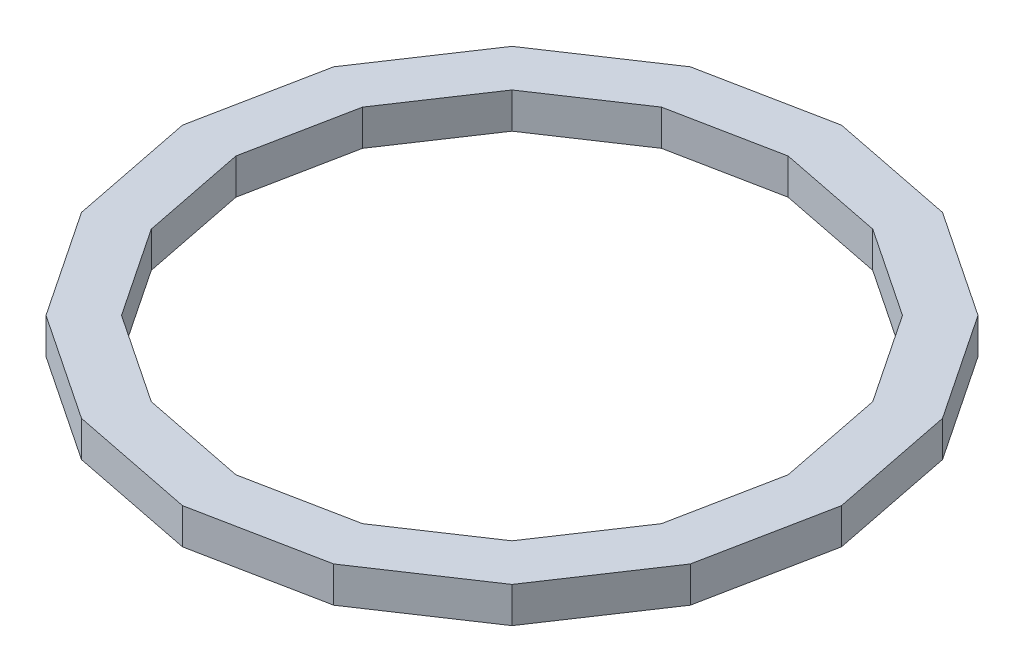
ISO-10303-21;
HEADER;
FILE_DESCRIPTION(('STEP AP214'),'2;1');
FILE_NAME('part.step','',(''),(''),'','','');
FILE_SCHEMA(('AUTOMOTIVE_DESIGN { 1 0 10303 214 1 1 1 1 }'));
ENDSEC;
DATA;
#1=APPLICATION_CONTEXT('core data for automotive mechanical design processes');
#2=APPLICATION_PROTOCOL_DEFINITION('international standard','automotive_design',2000,#1);
#3=PRODUCT_CONTEXT('',#1,'mechanical');
#4=PRODUCT('Part','Part','',(#3));
#5=PRODUCT_RELATED_PRODUCT_CATEGORY('part','',(#4));
#6=PRODUCT_DEFINITION_FORMATION('','',#4);
#7=PRODUCT_DEFINITION_CONTEXT('part definition',#1,'design');
#8=PRODUCT_DEFINITION('design','',#6,#7);
#9=PRODUCT_DEFINITION_SHAPE('','',#8);
#10=(LENGTH_UNIT() NAMED_UNIT(*) SI_UNIT(.MILLI.,.METRE.));
#11=(NAMED_UNIT(*) PLANE_ANGLE_UNIT() SI_UNIT($,.RADIAN.));
#12=(NAMED_UNIT(*) SI_UNIT($,.STERADIAN.) SOLID_ANGLE_UNIT());
#13=UNCERTAINTY_MEASURE_WITH_UNIT(LENGTH_MEASURE(1.E-05),#10,'distance_accuracy_value','');
#14=(GEOMETRIC_REPRESENTATION_CONTEXT(3) GLOBAL_UNCERTAINTY_ASSIGNED_CONTEXT((#13)) GLOBAL_UNIT_ASSIGNED_CONTEXT((#10,
#11,#12)) REPRESENTATION_CONTEXT('',''));
#15=CARTESIAN_POINT('',(0.,0.,0.));
#16=DIRECTION('',(0.,0.,1.));
#17=DIRECTION('',(1.,0.,0.));
#18=AXIS2_PLACEMENT_3D('',#15,#16,#17);
#19=CARTESIAN_POINT('',(0.,19.05,0.));
#20=DIRECTION('',(0.,1.,0.));
#21=DIRECTION('',(0.,0.,1.));
#22=AXIS2_PLACEMENT_3D('',#19,#20,#21);
#23=PLANE('',#22);
#24=DIRECTION('',(0.195090322016117,0.,-0.980785280403233));
#25=VECTOR('',#24,1.);
#26=CARTESIAN_POINT('',(162.385447122247,19.05,67.2622545300517));
#27=LINE('',#26,#25);
#28=CARTESIAN_POINT('',(162.385447122247,19.05,67.2622545300517));
#29=VERTEX_POINT('',#28);
#30=CARTESIAN_POINT('',(175.764741406112,19.05,-1.85172868969337E-12));
#31=VERTEX_POINT('',#30);
#32=EDGE_CURVE('E371',#29,#31,#27,.T.);
#33=ORIENTED_EDGE('',*,*,#32,.T.);
#34=DIRECTION('',(-0.195090322016139,0.,-0.980785280403228));
#35=VECTOR('',#34,1.);
#36=CARTESIAN_POINT('',(175.764741406112,19.05,-1.85172868969337E-12));
#37=LINE('',#36,#35);
#38=CARTESIAN_POINT('',(162.385447122245,19.05,-67.2622545300553));
#39=VERTEX_POINT('',#38);
#40=EDGE_CURVE('E374',#31,#39,#37,.T.);
#41=ORIENTED_EDGE('',*,*,#40,.T.);
#42=DIRECTION('',(-0.555570233019612,0.,-0.831469612302539));
#43=VECTOR('',#42,1.);
#44=CARTESIAN_POINT('',(162.385447122245,19.05,-67.2622545300553));
#45=LINE('',#44,#43);
#46=CARTESIAN_POINT('',(124.284440541761,19.05,-124.284440541763));
#47=VERTEX_POINT('',#46);
#48=EDGE_CURVE('E377',#39,#47,#45,.T.);
#49=ORIENTED_EDGE('',*,*,#48,.T.);
#50=DIRECTION('',(-0.831469612302552,0.,-0.555570233019593));
#51=VECTOR('',#50,1.);
#52=CARTESIAN_POINT('',(124.284440541761,19.05,-124.284440541763));
#53=LINE('',#52,#51);
#54=CARTESIAN_POINT('',(67.2622545300515,19.05,-162.385447122247));
#55=VERTEX_POINT('',#54);
#56=EDGE_CURVE('E379',#47,#55,#53,.T.);
#57=ORIENTED_EDGE('',*,*,#56,.T.);
#58=DIRECTION('',(-0.980785280403233,0.,-0.195090322016118));
#59=VECTOR('',#58,1.);
#60=CARTESIAN_POINT('',(67.2622545300515,19.05,-162.385447122247));
#61=LINE('',#60,#59);
#62=CARTESIAN_POINT('',(-1.98610514297088E-12,19.05,-175.764741406112));
#63=VERTEX_POINT('',#62);
#64=EDGE_CURVE('E381',#55,#63,#61,.T.);
#65=ORIENTED_EDGE('',*,*,#64,.T.);
#66=DIRECTION('',(-0.980785280403228,0.,0.195090322016139));
#67=VECTOR('',#66,1.);
#68=CARTESIAN_POINT('',(-1.98610514297088E-12,19.05,-175.764741406112));
#69=LINE('',#68,#67);
#70=CARTESIAN_POINT('',(-67.2622545300553,19.05,-162.385447122246));
#71=VERTEX_POINT('',#70);
#72=EDGE_CURVE('E383',#63,#71,#69,.T.);
#73=ORIENTED_EDGE('',*,*,#72,.T.);
#74=DIRECTION('',(-0.831469612302539,0.,0.555570233019612));
#75=VECTOR('',#74,1.);
#76=CARTESIAN_POINT('',(-67.2622545300553,19.05,-162.385447122246));
#77=LINE('',#76,#75);
#78=CARTESIAN_POINT('',(-124.284440541763,19.05,-124.284440541761));
#79=VERTEX_POINT('',#78);
#80=EDGE_CURVE('E385',#71,#79,#77,.T.);
#81=ORIENTED_EDGE('',*,*,#80,.T.);
#82=DIRECTION('',(-0.555570233019593,0.,0.831469612302551));
#83=VECTOR('',#82,1.);
#84=CARTESIAN_POINT('',(-124.284440541763,19.05,-124.284440541761));
#85=LINE('',#84,#83);
#86=CARTESIAN_POINT('',(-162.385447122247,19.05,-67.2622545300517));
#87=VERTEX_POINT('',#86);
#88=EDGE_CURVE('E387',#79,#87,#85,.T.);
#89=ORIENTED_EDGE('',*,*,#88,.T.);
#90=DIRECTION('',(-0.195090322016117,0.,0.980785280403233));
#91=VECTOR('',#90,1.);
#92=CARTESIAN_POINT('',(-162.385447122247,19.05,-67.2622545300517));
#93=LINE('',#92,#91);
#94=CARTESIAN_POINT('',(-175.764741406112,19.05,1.97758315534075E-12));
#95=VERTEX_POINT('',#94);
#96=EDGE_CURVE('E389',#87,#95,#93,.T.);
#97=ORIENTED_EDGE('',*,*,#96,.T.);
#98=DIRECTION('',(0.195090322016139,0.,0.980785280403228));
#99=VECTOR('',#98,1.);
#100=CARTESIAN_POINT('',(-175.764741406112,19.05,1.97758315534075E-12));
#101=LINE('',#100,#99);
#102=CARTESIAN_POINT('',(-162.385447122246,19.05,67.2622545300552));
#103=VERTEX_POINT('',#102);
#104=EDGE_CURVE('E391',#95,#103,#101,.T.);
#105=ORIENTED_EDGE('',*,*,#104,.T.);
#106=DIRECTION('',(0.555570233019612,0.,0.831469612302539));
#107=VECTOR('',#106,1.);
#108=CARTESIAN_POINT('',(-162.385447122246,19.05,67.2622545300552));
#109=LINE('',#108,#107);
#110=CARTESIAN_POINT('',(-124.284440541761,19.05,124.284440541763));
#111=VERTEX_POINT('',#110);
#112=EDGE_CURVE('E393',#103,#111,#109,.T.);
#113=ORIENTED_EDGE('',*,*,#112,.T.);
#114=DIRECTION('',(0.831469612302552,0.,0.555570233019593));
#115=VECTOR('',#114,1.);
#116=CARTESIAN_POINT('',(-124.284440541761,19.05,124.284440541763));
#117=LINE('',#116,#115);
#118=CARTESIAN_POINT('',(-67.2622545300517,19.05,162.385447122247));
#119=VERTEX_POINT('',#118);
#120=EDGE_CURVE('E395',#111,#119,#117,.T.);
#121=ORIENTED_EDGE('',*,*,#120,.T.);
#122=DIRECTION('',(0.980785280403233,0.,0.195090322016118));
#123=VECTOR('',#122,1.);
#124=CARTESIAN_POINT('',(-67.2622545300517,19.05,162.385447122247));
#125=LINE('',#124,#123);
#126=CARTESIAN_POINT('',(1.84282294494199E-12,19.05,175.764741406112));
#127=VERTEX_POINT('',#126);
#128=EDGE_CURVE('E397',#119,#127,#125,.T.);
#129=ORIENTED_EDGE('',*,*,#128,.T.);
#130=DIRECTION('',(0.980785280403228,0.,-0.195090322016139));
#131=VECTOR('',#130,1.);
#132=CARTESIAN_POINT('',(1.84282294494199E-12,19.05,175.764741406112));
#133=LINE('',#132,#131);
#134=CARTESIAN_POINT('',(67.2622545300552,19.05,162.385447122246));
#135=VERTEX_POINT('',#134);
#136=EDGE_CURVE('E399',#127,#135,#133,.T.);
#137=ORIENTED_EDGE('',*,*,#136,.T.);
#138=DIRECTION('',(0.831469612302539,0.,-0.555570233019611));
#139=VECTOR('',#138,1.);
#140=CARTESIAN_POINT('',(67.2622545300552,19.05,162.385447122246));
#141=LINE('',#140,#139);
#142=CARTESIAN_POINT('',(124.284440541763,19.05,124.284440541761));
#143=VERTEX_POINT('',#142);
#144=EDGE_CURVE('E401',#135,#143,#141,.T.);
#145=ORIENTED_EDGE('',*,*,#144,.T.);
#146=DIRECTION('',(0.555570233019593,0.,-0.831469612302551));
#147=VECTOR('',#146,1.);
#148=CARTESIAN_POINT('',(124.284440541763,19.05,124.284440541761));
#149=LINE('',#148,#147);
#150=EDGE_CURVE('E403',#143,#29,#149,.T.);
#151=ORIENTED_EDGE('',*,*,#150,.T.);
#152=EDGE_LOOP('',(#33,#41,#49,#57,#65,#73,#81,#89,#97,#105,#113,#121,#129,#137,#145,#151));
#153=FACE_BOUND('',#152,.T.);
#154=DIRECTION('',(-0.19509032201614,0.,-0.980785280403228));
#155=VECTOR('',#154,1.);
#156=CARTESIAN_POINT('',(147.277364445772,19.05,-1.60985125176022E-12));
#157=LINE('',#156,#155);
#158=CARTESIAN_POINT('',(147.277364445772,19.05,-1.60985125176022E-12));
#159=VERTEX_POINT('',#158);
#160=CARTESIAN_POINT('',(136.066542613654,19.05,-56.3606073357939));
#161=VERTEX_POINT('',#160);
#162=EDGE_CURVE('E252',#159,#161,#157,.T.);
#163=ORIENTED_EDGE('',*,*,#162,.F.);
#164=DIRECTION('',(0.195090322016118,0.,-0.980785280403232));
#165=VECTOR('',#164,1.);
#166=CARTESIAN_POINT('',(136.066542613655,19.05,56.3606073357907));
#167=LINE('',#166,#165);
#168=CARTESIAN_POINT('',(136.066542613655,19.05,56.3606073357907));
#169=VERTEX_POINT('',#168);
#170=EDGE_CURVE('E244',#169,#159,#167,.T.);
#171=ORIENTED_EDGE('',*,*,#170,.F.);
#172=DIRECTION('',(0.555570233019593,0.,-0.831469612302551));
#173=VECTOR('',#172,1.);
#174=CARTESIAN_POINT('',(104.140823114889,19.05,104.140823114887));
#175=LINE('',#174,#173);
#176=CARTESIAN_POINT('',(104.140823114889,19.05,104.140823114887));
#177=VERTEX_POINT('',#176);
#178=EDGE_CURVE('E296',#177,#169,#175,.T.);
#179=ORIENTED_EDGE('',*,*,#178,.F.);
#180=DIRECTION('',(0.831469612302539,0.,-0.555570233019611));
#181=VECTOR('',#180,1.);
#182=CARTESIAN_POINT('',(56.3606073357938,19.05,136.066542613654));
#183=LINE('',#182,#181);
#184=CARTESIAN_POINT('',(56.3606073357938,19.05,136.066542613654));
#185=VERTEX_POINT('',#184);
#186=EDGE_CURVE('E294',#185,#177,#183,.T.);
#187=ORIENTED_EDGE('',*,*,#186,.F.);
#188=DIRECTION('',(0.980785280403228,0.,-0.19509032201614));
#189=VECTOR('',#188,1.);
#190=CARTESIAN_POINT('',(1.670142461166E-12,19.05,147.277364445772));
#191=LINE('',#190,#189);
#192=CARTESIAN_POINT('',(1.670142461166E-12,19.05,147.277364445772));
#193=VERTEX_POINT('',#192);
#194=EDGE_CURVE('E292',#193,#185,#191,.T.);
#195=ORIENTED_EDGE('',*,*,#194,.F.);
#196=DIRECTION('',(0.980785280403233,0.,0.195090322016117));
#197=VECTOR('',#196,1.);
#198=CARTESIAN_POINT('',(-56.3606073357907,19.05,136.066542613655));
#199=LINE('',#198,#197);
#200=CARTESIAN_POINT('',(-56.3606073357907,19.05,136.066542613655));
#201=VERTEX_POINT('',#200);
#202=EDGE_CURVE('E290',#201,#193,#199,.T.);
#203=ORIENTED_EDGE('',*,*,#202,.F.);
#204=DIRECTION('',(0.831469612302552,0.,0.555570233019593));
#205=VECTOR('',#204,1.);
#206=CARTESIAN_POINT('',(-104.140823114887,19.05,104.140823114889));
#207=LINE('',#206,#205);
#208=CARTESIAN_POINT('',(-104.140823114887,19.05,104.140823114889));
#209=VERTEX_POINT('',#208);
#210=EDGE_CURVE('E288',#209,#201,#207,.T.);
#211=ORIENTED_EDGE('',*,*,#210,.F.);
#212=DIRECTION('',(0.555570233019612,0.,0.831469612302539));
#213=VECTOR('',#212,1.);
#214=CARTESIAN_POINT('',(-136.066542613654,19.05,56.3606073357939));
#215=LINE('',#214,#213);
#216=CARTESIAN_POINT('',(-136.066542613654,19.05,56.3606073357939));
#217=VERTEX_POINT('',#216);
#218=EDGE_CURVE('E286',#217,#209,#215,.T.);
#219=ORIENTED_EDGE('',*,*,#218,.F.);
#220=DIRECTION('',(0.195090322016139,0.,0.980785280403228));
#221=VECTOR('',#220,1.);
#222=CARTESIAN_POINT('',(-147.277364445772,19.05,1.65875656036756E-12));
#223=LINE('',#222,#221);
#224=CARTESIAN_POINT('',(-147.277364445772,19.05,1.65875656036756E-12));
#225=VERTEX_POINT('',#224);
#226=EDGE_CURVE('E283',#225,#217,#223,.T.);
#227=ORIENTED_EDGE('',*,*,#226,.F.);
#228=DIRECTION('',(-0.195090322016117,0.,0.980785280403233));
#229=VECTOR('',#228,1.);
#230=CARTESIAN_POINT('',(-136.066542613655,19.05,-56.3606073357907));
#231=LINE('',#230,#229);
#232=CARTESIAN_POINT('',(-136.066542613655,19.05,-56.3606073357907));
#233=VERTEX_POINT('',#232);
#234=EDGE_CURVE('E281',#233,#225,#231,.T.);
#235=ORIENTED_EDGE('',*,*,#234,.F.);
#236=DIRECTION('',(-0.555570233019593,0.,0.831469612302551));
#237=VECTOR('',#236,1.);
#238=CARTESIAN_POINT('',(-104.140823114889,19.05,-104.140823114887));
#239=LINE('',#238,#237);
#240=CARTESIAN_POINT('',(-104.140823114889,19.05,-104.140823114887));
#241=VERTEX_POINT('',#240);
#242=EDGE_CURVE('E278',#241,#233,#239,.T.);
#243=ORIENTED_EDGE('',*,*,#242,.F.);
#244=DIRECTION('',(-0.831469612302539,0.,0.555570233019612));
#245=VECTOR('',#244,1.);
#246=CARTESIAN_POINT('',(-56.3606073357939,19.05,-136.066542613654));
#247=LINE('',#246,#245);
#248=CARTESIAN_POINT('',(-56.3606073357939,19.05,-136.066542613654));
#249=VERTEX_POINT('',#248);
#250=EDGE_CURVE('E275',#249,#241,#247,.T.);
#251=ORIENTED_EDGE('',*,*,#250,.F.);
#252=DIRECTION('',(-0.980785280403228,0.,0.195090322016139));
#253=VECTOR('',#252,1.);
#254=CARTESIAN_POINT('',(-1.67239189089076E-12,19.05,-147.277364445772));
#255=LINE('',#254,#253);
#256=CARTESIAN_POINT('',(-1.67239189089076E-12,19.05,-147.277364445772));
#257=VERTEX_POINT('',#256);
#258=EDGE_CURVE('E273',#257,#249,#255,.T.);
#259=ORIENTED_EDGE('',*,*,#258,.F.);
#260=DIRECTION('',(-0.980785280403233,0.,-0.195090322016117));
#261=VECTOR('',#260,1.);
#262=CARTESIAN_POINT('',(56.3606073357907,19.05,-136.066542613655));
#263=LINE('',#262,#261);
#264=CARTESIAN_POINT('',(56.3606073357907,19.05,-136.066542613655));
#265=VERTEX_POINT('',#264);
#266=EDGE_CURVE('E271',#265,#257,#263,.T.);
#267=ORIENTED_EDGE('',*,*,#266,.F.);
#268=DIRECTION('',(-0.831469612302552,0.,-0.555570233019593));
#269=VECTOR('',#268,1.);
#270=CARTESIAN_POINT('',(104.140823114887,19.05,-104.140823114889));
#271=LINE('',#270,#269);
#272=CARTESIAN_POINT('',(104.140823114887,19.05,-104.140823114889));
#273=VERTEX_POINT('',#272);
#274=EDGE_CURVE('E267',#273,#265,#271,.T.);
#275=ORIENTED_EDGE('',*,*,#274,.F.);
#276=DIRECTION('',(-0.555570233019612,0.,-0.831469612302539));
#277=VECTOR('',#276,1.);
#278=CARTESIAN_POINT('',(136.066542613654,19.05,-56.3606073357939));
#279=LINE('',#278,#277);
#280=EDGE_CURVE('E265',#161,#273,#279,.T.);
#281=ORIENTED_EDGE('',*,*,#280,.F.);
#282=EDGE_LOOP('',(#163,#171,#179,#187,#195,#203,#211,#219,#227,#235,#243,#251,#259,#267,#275,#281));
#283=FACE_BOUND('',#282,.T.);
#284=ADVANCED_FACE('F35',(#153,#283),#23,.T.);
#285=CARTESIAN_POINT('',(0.,0.,0.));
#286=DIRECTION('',(0.,1.,0.));
#287=DIRECTION('',(0.,0.,1.));
#288=AXIS2_PLACEMENT_3D('',#285,#286,#287);
#289=PLANE('',#288);
#290=DIRECTION('',(0.195090322016117,0.,-0.980785280403233));
#291=VECTOR('',#290,1.);
#292=CARTESIAN_POINT('',(162.385447122247,0.,67.2622545300517));
#293=LINE('',#292,#291);
#294=CARTESIAN_POINT('',(162.385447122247,0.,67.2622545300517));
#295=VERTEX_POINT('',#294);
#296=CARTESIAN_POINT('',(175.764741406112,0.,-1.85172868969337E-12));
#297=VERTEX_POINT('',#296);
#298=EDGE_CURVE('E260',#295,#297,#293,.T.);
#299=ORIENTED_EDGE('',*,*,#298,.F.);
#300=DIRECTION('',(0.555570233019593,0.,-0.831469612302551));
#301=VECTOR('',#300,1.);
#302=CARTESIAN_POINT('',(124.284440541763,0.,124.284440541761));
#303=LINE('',#302,#301);
#304=CARTESIAN_POINT('',(124.284440541763,0.,124.284440541761));
#305=VERTEX_POINT('',#304);
#306=EDGE_CURVE('E375',#305,#295,#303,.T.);
#307=ORIENTED_EDGE('',*,*,#306,.F.);
#308=DIRECTION('',(0.831469612302539,0.,-0.555570233019611));
#309=VECTOR('',#308,1.);
#310=CARTESIAN_POINT('',(67.2622545300552,0.,162.385447122246));
#311=LINE('',#310,#309);
#312=CARTESIAN_POINT('',(67.2622545300552,0.,162.385447122246));
#313=VERTEX_POINT('',#312);
#314=EDGE_CURVE('E438',#313,#305,#311,.T.);
#315=ORIENTED_EDGE('',*,*,#314,.F.);
#316=DIRECTION('',(0.980785280403228,0.,-0.195090322016139));
#317=VECTOR('',#316,1.);
#318=CARTESIAN_POINT('',(1.84282294494199E-12,0.,175.764741406112));
#319=LINE('',#318,#317);
#320=CARTESIAN_POINT('',(1.84282294494199E-12,0.,175.764741406112));
#321=VERTEX_POINT('',#320);
#322=EDGE_CURVE('E435',#321,#313,#319,.T.);
#323=ORIENTED_EDGE('',*,*,#322,.F.);
#324=DIRECTION('',(0.980785280403233,0.,0.195090322016118));
#325=VECTOR('',#324,1.);
#326=CARTESIAN_POINT('',(-67.2622545300517,0.,162.385447122247));
#327=LINE('',#326,#325);
#328=CARTESIAN_POINT('',(-67.2622545300517,0.,162.385447122247));
#329=VERTEX_POINT('',#328);
#330=EDGE_CURVE('E433',#329,#321,#327,.T.);
#331=ORIENTED_EDGE('',*,*,#330,.F.);
#332=DIRECTION('',(0.831469612302552,0.,0.555570233019593));
#333=VECTOR('',#332,1.);
#334=CARTESIAN_POINT('',(-124.284440541761,0.,124.284440541763));
#335=LINE('',#334,#333);
#336=CARTESIAN_POINT('',(-124.284440541761,0.,124.284440541763));
#337=VERTEX_POINT('',#336);
#338=EDGE_CURVE('E430',#337,#329,#335,.T.);
#339=ORIENTED_EDGE('',*,*,#338,.F.);
#340=DIRECTION('',(0.555570233019612,0.,0.831469612302539));
#341=VECTOR('',#340,1.);
#342=CARTESIAN_POINT('',(-162.385447122246,0.,67.2622545300552));
#343=LINE('',#342,#341);
#344=CARTESIAN_POINT('',(-162.385447122246,0.,67.2622545300552));
#345=VERTEX_POINT('',#344);
#346=EDGE_CURVE('E428',#345,#337,#343,.T.);
#347=ORIENTED_EDGE('',*,*,#346,.F.);
#348=DIRECTION('',(0.195090322016139,0.,0.980785280403228));
#349=VECTOR('',#348,1.);
#350=CARTESIAN_POINT('',(-175.764741406112,0.,1.97758315534075E-12));
#351=LINE('',#350,#349);
#352=CARTESIAN_POINT('',(-175.764741406112,0.,1.97758315534075E-12));
#353=VERTEX_POINT('',#352);
#354=EDGE_CURVE('E426',#353,#345,#351,.T.);
#355=ORIENTED_EDGE('',*,*,#354,.F.);
#356=DIRECTION('',(-0.195090322016117,0.,0.980785280403233));
#357=VECTOR('',#356,1.);
#358=CARTESIAN_POINT('',(-162.385447122247,0.,-67.2622545300517));
#359=LINE('',#358,#357);
#360=CARTESIAN_POINT('',(-162.385447122247,0.,-67.2622545300517));
#361=VERTEX_POINT('',#360);
#362=EDGE_CURVE('E423',#361,#353,#359,.T.);
#363=ORIENTED_EDGE('',*,*,#362,.F.);
#364=DIRECTION('',(-0.555570233019593,0.,0.831469612302551));
#365=VECTOR('',#364,1.);
#366=CARTESIAN_POINT('',(-124.284440541763,0.,-124.284440541761));
#367=LINE('',#366,#365);
#368=CARTESIAN_POINT('',(-124.284440541763,0.,-124.284440541761));
#369=VERTEX_POINT('',#368);
#370=EDGE_CURVE('E421',#369,#361,#367,.T.);
#371=ORIENTED_EDGE('',*,*,#370,.F.);
#372=DIRECTION('',(-0.831469612302539,0.,0.555570233019612));
#373=VECTOR('',#372,1.);
#374=CARTESIAN_POINT('',(-67.2622545300553,0.,-162.385447122246));
#375=LINE('',#374,#373);
#376=CARTESIAN_POINT('',(-67.2622545300553,0.,-162.385447122246));
#377=VERTEX_POINT('',#376);
#378=EDGE_CURVE('E419',#377,#369,#375,.T.);
#379=ORIENTED_EDGE('',*,*,#378,.F.);
#380=DIRECTION('',(-0.980785280403228,0.,0.195090322016139));
#381=VECTOR('',#380,1.);
#382=CARTESIAN_POINT('',(-1.98610514297088E-12,0.,-175.764741406112));
#383=LINE('',#382,#381);
#384=CARTESIAN_POINT('',(-1.98610514297088E-12,0.,-175.764741406112));
#385=VERTEX_POINT('',#384);
#386=EDGE_CURVE('E417',#385,#377,#383,.T.);
#387=ORIENTED_EDGE('',*,*,#386,.F.);
#388=DIRECTION('',(-0.980785280403233,0.,-0.195090322016118));
#389=VECTOR('',#388,1.);
#390=CARTESIAN_POINT('',(67.2622545300515,0.,-162.385447122247));
#391=LINE('',#390,#389);
#392=CARTESIAN_POINT('',(67.2622545300515,0.,-162.385447122247));
#393=VERTEX_POINT('',#392);
#394=EDGE_CURVE('E415',#393,#385,#391,.T.);
#395=ORIENTED_EDGE('',*,*,#394,.F.);
#396=DIRECTION('',(-0.831469612302552,0.,-0.555570233019593));
#397=VECTOR('',#396,1.);
#398=CARTESIAN_POINT('',(124.284440541761,0.,-124.284440541763));
#399=LINE('',#398,#397);
#400=CARTESIAN_POINT('',(124.284440541761,0.,-124.284440541763));
#401=VERTEX_POINT('',#400);
#402=EDGE_CURVE('E413',#401,#393,#399,.T.);
#403=ORIENTED_EDGE('',*,*,#402,.F.);
#404=DIRECTION('',(-0.555570233019612,0.,-0.831469612302539));
#405=VECTOR('',#404,1.);
#406=CARTESIAN_POINT('',(162.385447122245,0.,-67.2622545300553));
#407=LINE('',#406,#405);
#408=CARTESIAN_POINT('',(162.385447122245,0.,-67.2622545300553));
#409=VERTEX_POINT('',#408);
#410=EDGE_CURVE('E410',#409,#401,#407,.T.);
#411=ORIENTED_EDGE('',*,*,#410,.F.);
#412=DIRECTION('',(-0.195090322016139,0.,-0.980785280403228));
#413=VECTOR('',#412,1.);
#414=CARTESIAN_POINT('',(175.764741406112,0.,-1.85172868969337E-12));
#415=LINE('',#414,#413);
#416=EDGE_CURVE('E408',#297,#409,#415,.T.);
#417=ORIENTED_EDGE('',*,*,#416,.F.);
#418=EDGE_LOOP('',(#299,#307,#315,#323,#331,#339,#347,#355,#363,#371,#379,#387,#395,#403,#411,#417));
#419=FACE_BOUND('',#418,.T.);
#420=DIRECTION('',(0.195090322016118,0.,-0.980785280403232));
#421=VECTOR('',#420,1.);
#422=CARTESIAN_POINT('',(136.066542613655,0.,56.3606073357907));
#423=LINE('',#422,#421);
#424=CARTESIAN_POINT('',(136.066542613655,0.,56.3606073357907));
#425=VERTEX_POINT('',#424);
#426=CARTESIAN_POINT('',(147.277364445772,0.,-1.60985125176022E-12));
#427=VERTEX_POINT('',#426);
#428=EDGE_CURVE('E58',#425,#427,#423,.T.);
#429=ORIENTED_EDGE('',*,*,#428,.T.);
#430=DIRECTION('',(-0.19509032201614,0.,-0.980785280403228));
#431=VECTOR('',#430,1.);
#432=CARTESIAN_POINT('',(147.277364445772,0.,-1.60985125176022E-12));
#433=LINE('',#432,#431);
#434=CARTESIAN_POINT('',(136.066542613654,0.,-56.3606073357939));
#435=VERTEX_POINT('',#434);
#436=EDGE_CURVE('E259',#427,#435,#433,.T.);
#437=ORIENTED_EDGE('',*,*,#436,.T.);
#438=DIRECTION('',(-0.555570233019612,0.,-0.831469612302539));
#439=VECTOR('',#438,1.);
#440=CARTESIAN_POINT('',(136.066542613654,0.,-56.3606073357939));
#441=LINE('',#440,#439);
#442=CARTESIAN_POINT('',(104.140823114887,0.,-104.140823114889));
#443=VERTEX_POINT('',#442);
#444=EDGE_CURVE('E300',#435,#443,#441,.T.);
#445=ORIENTED_EDGE('',*,*,#444,.T.);
#446=DIRECTION('',(-0.831469612302552,0.,-0.555570233019593));
#447=VECTOR('',#446,1.);
#448=CARTESIAN_POINT('',(104.140823114887,0.,-104.140823114889));
#449=LINE('',#448,#447);
#450=CARTESIAN_POINT('',(56.3606073357907,0.,-136.066542613655));
#451=VERTEX_POINT('',#450);
#452=EDGE_CURVE('E303',#443,#451,#449,.T.);
#453=ORIENTED_EDGE('',*,*,#452,.T.);
#454=DIRECTION('',(-0.980785280403233,0.,-0.195090322016117));
#455=VECTOR('',#454,1.);
#456=CARTESIAN_POINT('',(56.3606073357907,0.,-136.066542613655));
#457=LINE('',#456,#455);
#458=CARTESIAN_POINT('',(-1.67239189089076E-12,0.,-147.277364445772));
#459=VERTEX_POINT('',#458);
#460=EDGE_CURVE('E307',#451,#459,#457,.T.);
#461=ORIENTED_EDGE('',*,*,#460,.T.);
#462=DIRECTION('',(-0.980785280403228,0.,0.195090322016139));
#463=VECTOR('',#462,1.);
#464=CARTESIAN_POINT('',(-1.67239189089076E-12,0.,-147.277364445772));
#465=LINE('',#464,#463);
#466=CARTESIAN_POINT('',(-56.3606073357939,0.,-136.066542613654));
#467=VERTEX_POINT('',#466);
#468=EDGE_CURVE('E310',#459,#467,#465,.T.);
#469=ORIENTED_EDGE('',*,*,#468,.T.);
#470=DIRECTION('',(-0.831469612302539,0.,0.555570233019612));
#471=VECTOR('',#470,1.);
#472=CARTESIAN_POINT('',(-56.3606073357939,0.,-136.066542613654));
#473=LINE('',#472,#471);
#474=CARTESIAN_POINT('',(-104.140823114889,0.,-104.140823114887));
#475=VERTEX_POINT('',#474);
#476=EDGE_CURVE('E313',#467,#475,#473,.T.);
#477=ORIENTED_EDGE('',*,*,#476,.T.);
#478=DIRECTION('',(-0.555570233019593,0.,0.831469612302551));
#479=VECTOR('',#478,1.);
#480=CARTESIAN_POINT('',(-104.140823114889,0.,-104.140823114887));
#481=LINE('',#480,#479);
#482=CARTESIAN_POINT('',(-136.066542613655,0.,-56.3606073357907));
#483=VERTEX_POINT('',#482);
#484=EDGE_CURVE('E316',#475,#483,#481,.T.);
#485=ORIENTED_EDGE('',*,*,#484,.T.);
#486=DIRECTION('',(-0.195090322016117,0.,0.980785280403233));
#487=VECTOR('',#486,1.);
#488=CARTESIAN_POINT('',(-136.066542613655,0.,-56.3606073357907));
#489=LINE('',#488,#487);
#490=CARTESIAN_POINT('',(-147.277364445772,0.,1.65875656036756E-12));
#491=VERTEX_POINT('',#490);
#492=EDGE_CURVE('E319',#483,#491,#489,.T.);
#493=ORIENTED_EDGE('',*,*,#492,.T.);
#494=DIRECTION('',(0.195090322016139,0.,0.980785280403228));
#495=VECTOR('',#494,1.);
#496=CARTESIAN_POINT('',(-147.277364445772,0.,1.65875656036756E-12));
#497=LINE('',#496,#495);
#498=CARTESIAN_POINT('',(-136.066542613654,0.,56.3606073357939));
#499=VERTEX_POINT('',#498);
#500=EDGE_CURVE('E322',#491,#499,#497,.T.);
#501=ORIENTED_EDGE('',*,*,#500,.T.);
#502=DIRECTION('',(0.555570233019612,0.,0.831469612302539));
#503=VECTOR('',#502,1.);
#504=CARTESIAN_POINT('',(-136.066542613654,0.,56.3606073357939));
#505=LINE('',#504,#503);
#506=CARTESIAN_POINT('',(-104.140823114887,0.,104.140823114889));
#507=VERTEX_POINT('',#506);
#508=EDGE_CURVE('E325',#499,#507,#505,.T.);
#509=ORIENTED_EDGE('',*,*,#508,.T.);
#510=DIRECTION('',(0.831469612302552,0.,0.555570233019593));
#511=VECTOR('',#510,1.);
#512=CARTESIAN_POINT('',(-104.140823114887,0.,104.140823114889));
#513=LINE('',#512,#511);
#514=CARTESIAN_POINT('',(-56.3606073357907,0.,136.066542613655));
#515=VERTEX_POINT('',#514);
#516=EDGE_CURVE('E328',#507,#515,#513,.T.);
#517=ORIENTED_EDGE('',*,*,#516,.T.);
#518=DIRECTION('',(0.980785280403233,0.,0.195090322016117));
#519=VECTOR('',#518,1.);
#520=CARTESIAN_POINT('',(-56.3606073357907,0.,136.066542613655));
#521=LINE('',#520,#519);
#522=CARTESIAN_POINT('',(1.670142461166E-12,0.,147.277364445772));
#523=VERTEX_POINT('',#522);
#524=EDGE_CURVE('E331',#515,#523,#521,.T.);
#525=ORIENTED_EDGE('',*,*,#524,.T.);
#526=DIRECTION('',(0.980785280403228,0.,-0.19509032201614));
#527=VECTOR('',#526,1.);
#528=CARTESIAN_POINT('',(1.670142461166E-12,0.,147.277364445772));
#529=LINE('',#528,#527);
#530=CARTESIAN_POINT('',(56.3606073357938,0.,136.066542613654));
#531=VERTEX_POINT('',#530);
#532=EDGE_CURVE('E335',#523,#531,#529,.T.);
#533=ORIENTED_EDGE('',*,*,#532,.T.);
#534=DIRECTION('',(0.831469612302539,0.,-0.555570233019611));
#535=VECTOR('',#534,1.);
#536=CARTESIAN_POINT('',(56.3606073357938,0.,136.066542613654));
#537=LINE('',#536,#535);
#538=CARTESIAN_POINT('',(104.140823114889,0.,104.140823114887));
#539=VERTEX_POINT('',#538);
#540=EDGE_CURVE('E338',#531,#539,#537,.T.);
#541=ORIENTED_EDGE('',*,*,#540,.T.);
#542=DIRECTION('',(0.555570233019593,0.,-0.831469612302551));
#543=VECTOR('',#542,1.);
#544=CARTESIAN_POINT('',(104.140823114889,0.,104.140823114887));
#545=LINE('',#544,#543);
#546=EDGE_CURVE('E253',#539,#425,#545,.T.);
#547=ORIENTED_EDGE('',*,*,#546,.T.);
#548=EDGE_LOOP('',(#429,#437,#445,#453,#461,#469,#477,#485,#493,#501,#509,#517,#525,#533,#541,#547));
#549=FACE_BOUND('',#548,.T.);
#550=ADVANCED_FACE('F498',(#419,#549),#289,.F.);
#551=CARTESIAN_POINT('',(162.385447122247,19.05,67.2622545300517));
#552=DIRECTION('',(-0.980785280403233,0.,-0.195090322016117));
#553=DIRECTION('',(-0.195090322016118,0.,0.980785280403233));
#554=AXIS2_PLACEMENT_3D('',#551,#552,#553);
#555=PLANE('',#554);
#556=ORIENTED_EDGE('',*,*,#298,.T.);
#557=DIRECTION('',(0.,-1.,0.));
#558=VECTOR('',#557,1.);
#559=CARTESIAN_POINT('',(175.764741406112,19.05,-1.85172868969337E-12));
#560=LINE('',#559,#558);
#561=EDGE_CURVE('E11',#31,#297,#560,.T.);
#562=ORIENTED_EDGE('',*,*,#561,.F.);
#563=ORIENTED_EDGE('',*,*,#32,.F.);
#564=DIRECTION('',(0.,-1.,0.));
#565=VECTOR('',#564,1.);
#566=CARTESIAN_POINT('',(162.385447122247,19.05,67.2622545300517));
#567=LINE('',#566,#565);
#568=EDGE_CURVE('E405',#29,#295,#567,.T.);
#569=ORIENTED_EDGE('',*,*,#568,.T.);
#570=EDGE_LOOP('',(#556,#562,#563,#569));
#571=FACE_BOUND('',#570,.T.);
#572=ADVANCED_FACE('F37',(#571),#555,.F.);
#573=CARTESIAN_POINT('',(175.764741406112,19.05,-1.85172868969337E-12));
#574=DIRECTION('',(-0.980785280403228,0.,0.195090322016139));
#575=DIRECTION('',(0.195090322016139,0.,0.980785280403228));
#576=AXIS2_PLACEMENT_3D('',#573,#574,#575);
#577=PLANE('',#576);
#578=ORIENTED_EDGE('',*,*,#416,.T.);
#579=DIRECTION('',(0.,-1.,0.));
#580=VECTOR('',#579,1.);
#581=CARTESIAN_POINT('',(162.385447122245,19.05,-67.2622545300553));
#582=LINE('',#581,#580);
#583=EDGE_CURVE('E43',#39,#409,#582,.T.);
#584=ORIENTED_EDGE('',*,*,#583,.F.);
#585=ORIENTED_EDGE('',*,*,#40,.F.);
#586=ORIENTED_EDGE('',*,*,#561,.T.);
#587=EDGE_LOOP('',(#578,#584,#585,#586));
#588=FACE_BOUND('',#587,.T.);
#589=ADVANCED_FACE('F515',(#588),#577,.F.);
#590=CARTESIAN_POINT('',(162.385447122245,19.05,-67.2622545300553));
#591=DIRECTION('',(-0.831469612302539,0.,0.555570233019612));
#592=DIRECTION('',(0.555570233019612,0.,0.831469612302539));
#593=AXIS2_PLACEMENT_3D('',#590,#591,#592);
#594=PLANE('',#593);
#595=ORIENTED_EDGE('',*,*,#410,.T.);
#596=DIRECTION('',(0.,-1.,0.));
#597=VECTOR('',#596,1.);
#598=CARTESIAN_POINT('',(124.284440541761,19.05,-124.284440541763));
#599=LINE('',#598,#597);
#600=EDGE_CURVE('E485',#47,#401,#599,.T.);
#601=ORIENTED_EDGE('',*,*,#600,.F.);
#602=ORIENTED_EDGE('',*,*,#48,.F.);
#603=ORIENTED_EDGE('',*,*,#583,.T.);
#604=EDGE_LOOP('',(#595,#601,#602,#603));
#605=FACE_BOUND('',#604,.T.);
#606=ADVANCED_FACE('F492',(#605),#594,.F.);
#607=CARTESIAN_POINT('',(124.284440541761,19.05,-124.284440541763));
#608=DIRECTION('',(-0.555570233019593,0.,0.831469612302552));
#609=DIRECTION('',(0.831469612302552,0.,0.555570233019593));
#610=AXIS2_PLACEMENT_3D('',#607,#608,#609);
#611=PLANE('',#610);
#612=ORIENTED_EDGE('',*,*,#402,.T.);
#613=DIRECTION('',(0.,-1.,0.));
#614=VECTOR('',#613,1.);
#615=CARTESIAN_POINT('',(67.2622545300515,19.05,-162.385447122247));
#616=LINE('',#615,#614);
#617=EDGE_CURVE('E482',#55,#393,#616,.T.);
#618=ORIENTED_EDGE('',*,*,#617,.F.);
#619=ORIENTED_EDGE('',*,*,#56,.F.);
#620=ORIENTED_EDGE('',*,*,#600,.T.);
#621=EDGE_LOOP('',(#612,#618,#619,#620));
#622=FACE_BOUND('',#621,.T.);
#623=ADVANCED_FACE('F504',(#622),#611,.F.);
#624=CARTESIAN_POINT('',(67.2622545300515,19.05,-162.385447122247));
#625=DIRECTION('',(-0.195090322016118,0.,0.980785280403233));
#626=DIRECTION('',(0.980785280403233,0.,0.195090322016118));
#627=AXIS2_PLACEMENT_3D('',#624,#625,#626);
#628=PLANE('',#627);
#629=ORIENTED_EDGE('',*,*,#394,.T.);
#630=DIRECTION('',(0.,-1.,0.));
#631=VECTOR('',#630,1.);
#632=CARTESIAN_POINT('',(-1.98610514297088E-12,19.05,-175.764741406112));
#633=LINE('',#632,#631);
#634=EDGE_CURVE('E479',#63,#385,#633,.T.);
#635=ORIENTED_EDGE('',*,*,#634,.F.);
#636=ORIENTED_EDGE('',*,*,#64,.F.);
#637=ORIENTED_EDGE('',*,*,#617,.T.);
#638=EDGE_LOOP('',(#629,#635,#636,#637));
#639=FACE_BOUND('',#638,.T.);
#640=ADVANCED_FACE('F508',(#639),#628,.F.);
#641=CARTESIAN_POINT('',(-1.98610514297088E-12,19.05,-175.764741406112));
#642=DIRECTION('',(0.195090322016139,0.,0.980785280403228));
#643=DIRECTION('',(0.980785280403228,0.,-0.195090322016139));
#644=AXIS2_PLACEMENT_3D('',#641,#642,#643);
#645=PLANE('',#644);
#646=ORIENTED_EDGE('',*,*,#386,.T.);
#647=DIRECTION('',(0.,-1.,0.));
#648=VECTOR('',#647,1.);
#649=CARTESIAN_POINT('',(-67.2622545300553,19.05,-162.385447122246));
#650=LINE('',#649,#648);
#651=EDGE_CURVE('E476',#71,#377,#650,.T.);
#652=ORIENTED_EDGE('',*,*,#651,.F.);
#653=ORIENTED_EDGE('',*,*,#72,.F.);
#654=ORIENTED_EDGE('',*,*,#634,.T.);
#655=EDGE_LOOP('',(#646,#652,#653,#654));
#656=FACE_BOUND('',#655,.T.);
#657=ADVANCED_FACE('F568',(#656),#645,.F.);
#658=CARTESIAN_POINT('',(-67.2622545300553,19.05,-162.385447122246));
#659=DIRECTION('',(0.555570233019612,0.,0.831469612302539));
#660=DIRECTION('',(0.831469612302539,0.,-0.555570233019612));
#661=AXIS2_PLACEMENT_3D('',#658,#659,#660);
#662=PLANE('',#661);
#663=ORIENTED_EDGE('',*,*,#378,.T.);
#664=DIRECTION('',(0.,-1.,0.));
#665=VECTOR('',#664,1.);
#666=CARTESIAN_POINT('',(-124.284440541763,19.05,-124.284440541761));
#667=LINE('',#666,#665);
#668=EDGE_CURVE('E473',#79,#369,#667,.T.);
#669=ORIENTED_EDGE('',*,*,#668,.F.);
#670=ORIENTED_EDGE('',*,*,#80,.F.);
#671=ORIENTED_EDGE('',*,*,#651,.T.);
#672=EDGE_LOOP('',(#663,#669,#670,#671));
#673=FACE_BOUND('',#672,.T.);
#674=ADVANCED_FACE('F565',(#673),#662,.F.);
#675=CARTESIAN_POINT('',(-124.284440541763,19.05,-124.284440541761));
#676=DIRECTION('',(0.831469612302551,0.,0.555570233019593));
#677=DIRECTION('',(0.555570233019593,0.,-0.831469612302552));
#678=AXIS2_PLACEMENT_3D('',#675,#676,#677);
#679=PLANE('',#678);
#680=ORIENTED_EDGE('',*,*,#370,.T.);
#681=DIRECTION('',(0.,-1.,0.));
#682=VECTOR('',#681,1.);
#683=CARTESIAN_POINT('',(-162.385447122247,19.05,-67.2622545300517));
#684=LINE('',#683,#682);
#685=EDGE_CURVE('E469',#87,#361,#684,.T.);
#686=ORIENTED_EDGE('',*,*,#685,.F.);
#687=ORIENTED_EDGE('',*,*,#88,.F.);
#688=ORIENTED_EDGE('',*,*,#668,.T.);
#689=EDGE_LOOP('',(#680,#686,#687,#688));
#690=FACE_BOUND('',#689,.T.);
#691=ADVANCED_FACE('F561',(#690),#679,.F.);
#692=CARTESIAN_POINT('',(-162.385447122247,19.05,-67.2622545300517));
#693=DIRECTION('',(0.980785280403233,0.,0.195090322016117));
#694=DIRECTION('',(0.195090322016118,0.,-0.980785280403233));
#695=AXIS2_PLACEMENT_3D('',#692,#693,#694);
#696=PLANE('',#695);
#697=ORIENTED_EDGE('',*,*,#362,.T.);
#698=DIRECTION('',(0.,-1.,0.));
#699=VECTOR('',#698,1.);
#700=CARTESIAN_POINT('',(-175.764741406112,19.05,1.97758315534075E-12));
#701=LINE('',#700,#699);
#702=EDGE_CURVE('E466',#95,#353,#701,.T.);
#703=ORIENTED_EDGE('',*,*,#702,.F.);
#704=ORIENTED_EDGE('',*,*,#96,.F.);
#705=ORIENTED_EDGE('',*,*,#685,.T.);
#706=EDGE_LOOP('',(#697,#703,#704,#705));
#707=FACE_BOUND('',#706,.T.);
#708=ADVANCED_FACE('F557',(#707),#696,.F.);
#709=CARTESIAN_POINT('',(-175.764741406112,19.05,1.97758315534075E-12));
#710=DIRECTION('',(0.980785280403228,0.,-0.195090322016139));
#711=DIRECTION('',(-0.195090322016139,0.,-0.980785280403228));
#712=AXIS2_PLACEMENT_3D('',#709,#710,#711);
#713=PLANE('',#712);
#714=ORIENTED_EDGE('',*,*,#354,.T.);
#715=DIRECTION('',(0.,-1.,0.));
#716=VECTOR('',#715,1.);
#717=CARTESIAN_POINT('',(-162.385447122246,19.05,67.2622545300552));
#718=LINE('',#717,#716);
#719=EDGE_CURVE('E462',#103,#345,#718,.T.);
#720=ORIENTED_EDGE('',*,*,#719,.F.);
#721=ORIENTED_EDGE('',*,*,#104,.F.);
#722=ORIENTED_EDGE('',*,*,#702,.T.);
#723=EDGE_LOOP('',(#714,#720,#721,#722));
#724=FACE_BOUND('',#723,.T.);
#725=ADVANCED_FACE('F552',(#724),#713,.F.);
#726=CARTESIAN_POINT('',(-162.385447122246,19.05,67.2622545300552));
#727=DIRECTION('',(0.831469612302539,0.,-0.555570233019612));
#728=DIRECTION('',(-0.555570233019612,0.,-0.831469612302539));
#729=AXIS2_PLACEMENT_3D('',#726,#727,#728);
#730=PLANE('',#729);
#731=ORIENTED_EDGE('',*,*,#346,.T.);
#732=DIRECTION('',(0.,-1.,0.));
#733=VECTOR('',#732,1.);
#734=CARTESIAN_POINT('',(-124.284440541761,19.05,124.284440541763));
#735=LINE('',#734,#733);
#736=EDGE_CURVE('E459',#111,#337,#735,.T.);
#737=ORIENTED_EDGE('',*,*,#736,.F.);
#738=ORIENTED_EDGE('',*,*,#112,.F.);
#739=ORIENTED_EDGE('',*,*,#719,.T.);
#740=EDGE_LOOP('',(#731,#737,#738,#739));
#741=FACE_BOUND('',#740,.T.);
#742=ADVANCED_FACE('F546',(#741),#730,.F.);
#743=CARTESIAN_POINT('',(-124.284440541761,19.05,124.284440541763));
#744=DIRECTION('',(0.555570233019592,0.,-0.831469612302552));
#745=DIRECTION('',(-0.831469612302552,0.,-0.555570233019593));
#746=AXIS2_PLACEMENT_3D('',#743,#744,#745);
#747=PLANE('',#746);
#748=ORIENTED_EDGE('',*,*,#338,.T.);
#749=DIRECTION('',(0.,-1.,0.));
#750=VECTOR('',#749,1.);
#751=CARTESIAN_POINT('',(-67.2622545300517,19.05,162.385447122247));
#752=LINE('',#751,#750);
#753=EDGE_CURVE('E455',#119,#329,#752,.T.);
#754=ORIENTED_EDGE('',*,*,#753,.F.);
#755=ORIENTED_EDGE('',*,*,#120,.F.);
#756=ORIENTED_EDGE('',*,*,#736,.T.);
#757=EDGE_LOOP('',(#748,#754,#755,#756));
#758=FACE_BOUND('',#757,.T.);
#759=ADVANCED_FACE('F542',(#758),#747,.F.);
#760=CARTESIAN_POINT('',(-67.2622545300517,19.05,162.385447122247));
#761=DIRECTION('',(0.195090322016118,0.,-0.980785280403233));
#762=DIRECTION('',(-0.980785280403233,0.,-0.195090322016118));
#763=AXIS2_PLACEMENT_3D('',#760,#761,#762);
#764=PLANE('',#763);
#765=ORIENTED_EDGE('',*,*,#330,.T.);
#766=DIRECTION('',(0.,-1.,0.));
#767=VECTOR('',#766,1.);
#768=CARTESIAN_POINT('',(1.84282294494199E-12,19.05,175.764741406112));
#769=LINE('',#768,#767);
#770=EDGE_CURVE('E451',#127,#321,#769,.T.);
#771=ORIENTED_EDGE('',*,*,#770,.F.);
#772=ORIENTED_EDGE('',*,*,#128,.F.);
#773=ORIENTED_EDGE('',*,*,#753,.T.);
#774=EDGE_LOOP('',(#765,#771,#772,#773));
#775=FACE_BOUND('',#774,.T.);
#776=ADVANCED_FACE('F537',(#775),#764,.F.);
#777=CARTESIAN_POINT('',(1.84282294494199E-12,19.05,175.764741406112));
#778=DIRECTION('',(-0.195090322016139,0.,-0.980785280403228));
#779=DIRECTION('',(-0.980785280403228,0.,0.195090322016139));
#780=AXIS2_PLACEMENT_3D('',#777,#778,#779);
#781=PLANE('',#780);
#782=ORIENTED_EDGE('',*,*,#322,.T.);
#783=DIRECTION('',(0.,-1.,0.));
#784=VECTOR('',#783,1.);
#785=CARTESIAN_POINT('',(67.2622545300552,19.05,162.385447122246));
#786=LINE('',#785,#784);
#787=EDGE_CURVE('E447',#135,#313,#786,.T.);
#788=ORIENTED_EDGE('',*,*,#787,.F.);
#789=ORIENTED_EDGE('',*,*,#136,.F.);
#790=ORIENTED_EDGE('',*,*,#770,.T.);
#791=EDGE_LOOP('',(#782,#788,#789,#790));
#792=FACE_BOUND('',#791,.T.);
#793=ADVANCED_FACE('F531',(#792),#781,.F.);
#794=CARTESIAN_POINT('',(67.2622545300552,19.05,162.385447122246));
#795=DIRECTION('',(-0.555570233019611,0.,-0.831469612302539));
#796=DIRECTION('',(-0.831469612302539,0.,0.555570233019612));
#797=AXIS2_PLACEMENT_3D('',#794,#795,#796);
#798=PLANE('',#797);
#799=ORIENTED_EDGE('',*,*,#314,.T.);
#800=DIRECTION('',(0.,-1.,0.));
#801=VECTOR('',#800,1.);
#802=CARTESIAN_POINT('',(124.284440541763,19.05,124.284440541761));
#803=LINE('',#802,#801);
#804=EDGE_CURVE('E444',#143,#305,#803,.T.);
#805=ORIENTED_EDGE('',*,*,#804,.F.);
#806=ORIENTED_EDGE('',*,*,#144,.F.);
#807=ORIENTED_EDGE('',*,*,#787,.T.);
#808=EDGE_LOOP('',(#799,#805,#806,#807));
#809=FACE_BOUND('',#808,.T.);
#810=ADVANCED_FACE('F527',(#809),#798,.F.);
#811=CARTESIAN_POINT('',(124.284440541763,19.05,124.284440541761));
#812=DIRECTION('',(-0.831469612302551,0.,-0.555570233019593));
#813=DIRECTION('',(-0.555570233019593,0.,0.831469612302552));
#814=AXIS2_PLACEMENT_3D('',#811,#812,#813);
#815=PLANE('',#814);
#816=ORIENTED_EDGE('',*,*,#306,.T.);
#817=ORIENTED_EDGE('',*,*,#568,.F.);
#818=ORIENTED_EDGE('',*,*,#150,.F.);
#819=ORIENTED_EDGE('',*,*,#804,.T.);
#820=EDGE_LOOP('',(#816,#817,#818,#819));
#821=FACE_BOUND('',#820,.T.);
#822=ADVANCED_FACE('F522',(#821),#815,.F.);
#823=CARTESIAN_POINT('',(136.066542613655,19.05,56.3606073357907));
#824=DIRECTION('',(-0.980785280403233,0.,-0.195090322016118));
#825=DIRECTION('',(-0.195090322016118,0.,0.980785280403233));
#826=AXIS2_PLACEMENT_3D('',#823,#824,#825);
#827=PLANE('',#826);
#828=ORIENTED_EDGE('',*,*,#428,.F.);
#829=DIRECTION('',(0.,-1.,0.));
#830=VECTOR('',#829,1.);
#831=CARTESIAN_POINT('',(136.066542613655,19.05,56.3606073357907));
#832=LINE('',#831,#830);
#833=EDGE_CURVE('E248',#169,#425,#832,.T.);
#834=ORIENTED_EDGE('',*,*,#833,.F.);
#835=ORIENTED_EDGE('',*,*,#170,.T.);
#836=DIRECTION('',(0.,-1.,0.));
#837=VECTOR('',#836,1.);
#838=CARTESIAN_POINT('',(147.277364445772,19.05,-1.60985125176022E-12));
#839=LINE('',#838,#837);
#840=EDGE_CURVE('E247',#159,#427,#839,.T.);
#841=ORIENTED_EDGE('',*,*,#840,.T.);
#842=EDGE_LOOP('',(#828,#834,#835,#841));
#843=FACE_BOUND('',#842,.T.);
#844=ADVANCED_FACE('F246',(#843),#827,.T.);
#845=CARTESIAN_POINT('',(147.277364445772,19.05,-1.60985125176022E-12));
#846=DIRECTION('',(-0.980785280403228,0.,0.19509032201614));
#847=DIRECTION('',(0.19509032201614,0.,0.980785280403228));
#848=AXIS2_PLACEMENT_3D('',#845,#846,#847);
#849=PLANE('',#848);
#850=ORIENTED_EDGE('',*,*,#436,.F.);
#851=ORIENTED_EDGE('',*,*,#840,.F.);
#852=ORIENTED_EDGE('',*,*,#162,.T.);
#853=DIRECTION('',(0.,-1.,0.));
#854=VECTOR('',#853,1.);
#855=CARTESIAN_POINT('',(136.066542613654,19.05,-56.3606073357939));
#856=LINE('',#855,#854);
#857=EDGE_CURVE('E261',#161,#435,#856,.T.);
#858=ORIENTED_EDGE('',*,*,#857,.T.);
#859=EDGE_LOOP('',(#850,#851,#852,#858));
#860=FACE_BOUND('',#859,.T.);
#861=ADVANCED_FACE('F256',(#860),#849,.T.);
#862=CARTESIAN_POINT('',(136.066542613654,19.05,-56.3606073357939));
#863=DIRECTION('',(-0.831469612302539,0.,0.555570233019612));
#864=DIRECTION('',(0.555570233019612,0.,0.831469612302539));
#865=AXIS2_PLACEMENT_3D('',#862,#863,#864);
#866=PLANE('',#865);
#867=ORIENTED_EDGE('',*,*,#444,.F.);
#868=ORIENTED_EDGE('',*,*,#857,.F.);
#869=ORIENTED_EDGE('',*,*,#280,.T.);
#870=DIRECTION('',(0.,-1.,0.));
#871=VECTOR('',#870,1.);
#872=CARTESIAN_POINT('',(104.140823114887,19.05,-104.140823114889));
#873=LINE('',#872,#871);
#874=EDGE_CURVE('E368',#273,#443,#873,.T.);
#875=ORIENTED_EDGE('',*,*,#874,.T.);
#876=EDGE_LOOP('',(#867,#868,#869,#875));
#877=FACE_BOUND('',#876,.T.);
#878=ADVANCED_FACE('F650',(#877),#866,.T.);
#879=CARTESIAN_POINT('',(104.140823114887,19.05,-104.140823114889));
#880=DIRECTION('',(-0.555570233019593,0.,0.831469612302551));
#881=DIRECTION('',(0.831469612302551,0.,0.555570233019593));
#882=AXIS2_PLACEMENT_3D('',#879,#880,#881);
#883=PLANE('',#882);
#884=ORIENTED_EDGE('',*,*,#452,.F.);
#885=ORIENTED_EDGE('',*,*,#874,.F.);
#886=ORIENTED_EDGE('',*,*,#274,.T.);
#887=DIRECTION('',(0.,-1.,0.));
#888=VECTOR('',#887,1.);
#889=CARTESIAN_POINT('',(56.3606073357907,19.05,-136.066542613655));
#890=LINE('',#889,#888);
#891=EDGE_CURVE('E366',#265,#451,#890,.T.);
#892=ORIENTED_EDGE('',*,*,#891,.T.);
#893=EDGE_LOOP('',(#884,#885,#886,#892));
#894=FACE_BOUND('',#893,.T.);
#895=ADVANCED_FACE('F656',(#894),#883,.T.);
#896=CARTESIAN_POINT('',(56.3606073357907,19.05,-136.066542613655));
#897=DIRECTION('',(-0.195090322016117,0.,0.980785280403233));
#898=DIRECTION('',(0.980785280403233,0.,0.195090322016117));
#899=AXIS2_PLACEMENT_3D('',#896,#897,#898);
#900=PLANE('',#899);
#901=ORIENTED_EDGE('',*,*,#460,.F.);
#902=ORIENTED_EDGE('',*,*,#891,.F.);
#903=ORIENTED_EDGE('',*,*,#266,.T.);
#904=DIRECTION('',(0.,-1.,0.));
#905=VECTOR('',#904,1.);
#906=CARTESIAN_POINT('',(-1.67239189089076E-12,19.05,-147.277364445772));
#907=LINE('',#906,#905);
#908=EDGE_CURVE('E364',#257,#459,#907,.T.);
#909=ORIENTED_EDGE('',*,*,#908,.T.);
#910=EDGE_LOOP('',(#901,#902,#903,#909));
#911=FACE_BOUND('',#910,.T.);
#912=ADVANCED_FACE('F664',(#911),#900,.T.);
#913=CARTESIAN_POINT('',(-1.67239189089076E-12,19.05,-147.277364445772));
#914=DIRECTION('',(0.195090322016139,0.,0.980785280403228));
#915=DIRECTION('',(0.980785280403228,0.,-0.195090322016139));
#916=AXIS2_PLACEMENT_3D('',#913,#914,#915);
#917=PLANE('',#916);
#918=ORIENTED_EDGE('',*,*,#468,.F.);
#919=ORIENTED_EDGE('',*,*,#908,.F.);
#920=ORIENTED_EDGE('',*,*,#258,.T.);
#921=DIRECTION('',(0.,-1.,0.));
#922=VECTOR('',#921,1.);
#923=CARTESIAN_POINT('',(-56.3606073357939,19.05,-136.066542613654));
#924=LINE('',#923,#922);
#925=EDGE_CURVE('E362',#249,#467,#924,.T.);
#926=ORIENTED_EDGE('',*,*,#925,.T.);
#927=EDGE_LOOP('',(#918,#919,#920,#926));
#928=FACE_BOUND('',#927,.T.);
#929=ADVANCED_FACE('F672',(#928),#917,.T.);
#930=CARTESIAN_POINT('',(-56.3606073357939,19.05,-136.066542613654));
#931=DIRECTION('',(0.555570233019612,0.,0.831469612302539));
#932=DIRECTION('',(0.831469612302539,0.,-0.555570233019612));
#933=AXIS2_PLACEMENT_3D('',#930,#931,#932);
#934=PLANE('',#933);
#935=ORIENTED_EDGE('',*,*,#476,.F.);
#936=ORIENTED_EDGE('',*,*,#925,.F.);
#937=ORIENTED_EDGE('',*,*,#250,.T.);
#938=DIRECTION('',(0.,-1.,0.));
#939=VECTOR('',#938,1.);
#940=CARTESIAN_POINT('',(-104.140823114889,19.05,-104.140823114887));
#941=LINE('',#940,#939);
#942=EDGE_CURVE('E360',#241,#475,#941,.T.);
#943=ORIENTED_EDGE('',*,*,#942,.T.);
#944=EDGE_LOOP('',(#935,#936,#937,#943));
#945=FACE_BOUND('',#944,.T.);
#946=ADVANCED_FACE('F680',(#945),#934,.T.);
#947=CARTESIAN_POINT('',(-104.140823114889,19.05,-104.140823114887));
#948=DIRECTION('',(0.831469612302551,0.,0.555570233019593));
#949=DIRECTION('',(0.555570233019593,0.,-0.831469612302552));
#950=AXIS2_PLACEMENT_3D('',#947,#948,#949);
#951=PLANE('',#950);
#952=ORIENTED_EDGE('',*,*,#484,.F.);
#953=ORIENTED_EDGE('',*,*,#942,.F.);
#954=ORIENTED_EDGE('',*,*,#242,.T.);
#955=DIRECTION('',(0.,-1.,0.));
#956=VECTOR('',#955,1.);
#957=CARTESIAN_POINT('',(-136.066542613655,19.05,-56.3606073357907));
#958=LINE('',#957,#956);
#959=EDGE_CURVE('E358',#233,#483,#958,.T.);
#960=ORIENTED_EDGE('',*,*,#959,.T.);
#961=EDGE_LOOP('',(#952,#953,#954,#960));
#962=FACE_BOUND('',#961,.T.);
#963=ADVANCED_FACE('F688',(#962),#951,.T.);
#964=CARTESIAN_POINT('',(-136.066542613655,19.05,-56.3606073357907));
#965=DIRECTION('',(0.980785280403233,0.,0.195090322016117));
#966=DIRECTION('',(0.195090322016117,0.,-0.980785280403233));
#967=AXIS2_PLACEMENT_3D('',#964,#965,#966);
#968=PLANE('',#967);
#969=ORIENTED_EDGE('',*,*,#492,.F.);
#970=ORIENTED_EDGE('',*,*,#959,.F.);
#971=ORIENTED_EDGE('',*,*,#234,.T.);
#972=DIRECTION('',(0.,-1.,0.));
#973=VECTOR('',#972,1.);
#974=CARTESIAN_POINT('',(-147.277364445772,19.05,1.65875656036756E-12));
#975=LINE('',#974,#973);
#976=EDGE_CURVE('E355',#225,#491,#975,.T.);
#977=ORIENTED_EDGE('',*,*,#976,.T.);
#978=EDGE_LOOP('',(#969,#970,#971,#977));
#979=FACE_BOUND('',#978,.T.);
#980=ADVANCED_FACE('F696',(#979),#968,.T.);
#981=CARTESIAN_POINT('',(-147.277364445772,19.05,1.65875656036756E-12));
#982=DIRECTION('',(0.980785280403228,0.,-0.195090322016139));
#983=DIRECTION('',(-0.195090322016139,0.,-0.980785280403228));
#984=AXIS2_PLACEMENT_3D('',#981,#982,#983);
#985=PLANE('',#984);
#986=ORIENTED_EDGE('',*,*,#500,.F.);
#987=ORIENTED_EDGE('',*,*,#976,.F.);
#988=ORIENTED_EDGE('',*,*,#226,.T.);
#989=DIRECTION('',(0.,-1.,0.));
#990=VECTOR('',#989,1.);
#991=CARTESIAN_POINT('',(-136.066542613654,19.05,56.3606073357939));
#992=LINE('',#991,#990);
#993=EDGE_CURVE('E353',#217,#499,#992,.T.);
#994=ORIENTED_EDGE('',*,*,#993,.T.);
#995=EDGE_LOOP('',(#986,#987,#988,#994));
#996=FACE_BOUND('',#995,.T.);
#997=ADVANCED_FACE('F704',(#996),#985,.T.);
#998=CARTESIAN_POINT('',(-136.066542613654,19.05,56.3606073357939));
#999=DIRECTION('',(0.831469612302539,0.,-0.555570233019612));
#1000=DIRECTION('',(-0.555570233019612,0.,-0.831469612302539));
#1001=AXIS2_PLACEMENT_3D('',#998,#999,#1000);
#1002=PLANE('',#1001);
#1003=ORIENTED_EDGE('',*,*,#508,.F.);
#1004=ORIENTED_EDGE('',*,*,#993,.F.);
#1005=ORIENTED_EDGE('',*,*,#218,.T.);
#1006=DIRECTION('',(0.,-1.,0.));
#1007=VECTOR('',#1006,1.);
#1008=CARTESIAN_POINT('',(-104.140823114887,19.05,104.140823114889));
#1009=LINE('',#1008,#1007);
#1010=EDGE_CURVE('E351',#209,#507,#1009,.T.);
#1011=ORIENTED_EDGE('',*,*,#1010,.T.);
#1012=EDGE_LOOP('',(#1003,#1004,#1005,#1011));
#1013=FACE_BOUND('',#1012,.T.);
#1014=ADVANCED_FACE('F712',(#1013),#1002,.T.);
#1015=CARTESIAN_POINT('',(-104.140823114887,19.05,104.140823114889));
#1016=DIRECTION('',(0.555570233019593,0.,-0.831469612302552));
#1017=DIRECTION('',(-0.831469612302552,0.,-0.555570233019593));
#1018=AXIS2_PLACEMENT_3D('',#1015,#1016,#1017);
#1019=PLANE('',#1018);
#1020=ORIENTED_EDGE('',*,*,#516,.F.);
#1021=ORIENTED_EDGE('',*,*,#1010,.F.);
#1022=ORIENTED_EDGE('',*,*,#210,.T.);
#1023=DIRECTION('',(0.,-1.,0.));
#1024=VECTOR('',#1023,1.);
#1025=CARTESIAN_POINT('',(-56.3606073357907,19.05,136.066542613655));
#1026=LINE('',#1025,#1024);
#1027=EDGE_CURVE('E349',#201,#515,#1026,.T.);
#1028=ORIENTED_EDGE('',*,*,#1027,.T.);
#1029=EDGE_LOOP('',(#1020,#1021,#1022,#1028));
#1030=FACE_BOUND('',#1029,.T.);
#1031=ADVANCED_FACE('F720',(#1030),#1019,.T.);
#1032=CARTESIAN_POINT('',(-56.3606073357907,19.05,136.066542613655));
#1033=DIRECTION('',(0.195090322016117,0.,-0.980785280403233));
#1034=DIRECTION('',(-0.980785280403233,0.,-0.195090322016118));
#1035=AXIS2_PLACEMENT_3D('',#1032,#1033,#1034);
#1036=PLANE('',#1035);
#1037=ORIENTED_EDGE('',*,*,#524,.F.);
#1038=ORIENTED_EDGE('',*,*,#1027,.F.);
#1039=ORIENTED_EDGE('',*,*,#202,.T.);
#1040=DIRECTION('',(0.,-1.,0.));
#1041=VECTOR('',#1040,1.);
#1042=CARTESIAN_POINT('',(1.670142461166E-12,19.05,147.277364445772));
#1043=LINE('',#1042,#1041);
#1044=EDGE_CURVE('E347',#193,#523,#1043,.T.);
#1045=ORIENTED_EDGE('',*,*,#1044,.T.);
#1046=EDGE_LOOP('',(#1037,#1038,#1039,#1045));
#1047=FACE_BOUND('',#1046,.T.);
#1048=ADVANCED_FACE('F728',(#1047),#1036,.T.);
#1049=CARTESIAN_POINT('',(1.670142461166E-12,19.05,147.277364445772));
#1050=DIRECTION('',(-0.19509032201614,0.,-0.980785280403228));
#1051=DIRECTION('',(-0.980785280403228,0.,0.19509032201614));
#1052=AXIS2_PLACEMENT_3D('',#1049,#1050,#1051);
#1053=PLANE('',#1052);
#1054=ORIENTED_EDGE('',*,*,#532,.F.);
#1055=ORIENTED_EDGE('',*,*,#1044,.F.);
#1056=ORIENTED_EDGE('',*,*,#194,.T.);
#1057=DIRECTION('',(0.,-1.,0.));
#1058=VECTOR('',#1057,1.);
#1059=CARTESIAN_POINT('',(56.3606073357938,19.05,136.066542613654));
#1060=LINE('',#1059,#1058);
#1061=EDGE_CURVE('E345',#185,#531,#1060,.T.);
#1062=ORIENTED_EDGE('',*,*,#1061,.T.);
#1063=EDGE_LOOP('',(#1054,#1055,#1056,#1062));
#1064=FACE_BOUND('',#1063,.T.);
#1065=ADVANCED_FACE('F736',(#1064),#1053,.T.);
#1066=CARTESIAN_POINT('',(56.3606073357938,19.05,136.066542613654));
#1067=DIRECTION('',(-0.555570233019612,0.,-0.831469612302539));
#1068=DIRECTION('',(-0.831469612302539,0.,0.555570233019612));
#1069=AXIS2_PLACEMENT_3D('',#1066,#1067,#1068);
#1070=PLANE('',#1069);
#1071=ORIENTED_EDGE('',*,*,#540,.F.);
#1072=ORIENTED_EDGE('',*,*,#1061,.F.);
#1073=ORIENTED_EDGE('',*,*,#186,.T.);
#1074=DIRECTION('',(0.,-1.,0.));
#1075=VECTOR('',#1074,1.);
#1076=CARTESIAN_POINT('',(104.140823114889,19.05,104.140823114887));
#1077=LINE('',#1076,#1075);
#1078=EDGE_CURVE('E50',#177,#539,#1077,.T.);
#1079=ORIENTED_EDGE('',*,*,#1078,.T.);
#1080=EDGE_LOOP('',(#1071,#1072,#1073,#1079));
#1081=FACE_BOUND('',#1080,.T.);
#1082=ADVANCED_FACE('F744',(#1081),#1070,.T.);
#1083=CARTESIAN_POINT('',(104.140823114889,19.05,104.140823114887));
#1084=DIRECTION('',(-0.831469612302551,0.,-0.555570233019593));
#1085=DIRECTION('',(-0.555570233019593,0.,0.831469612302551));
#1086=AXIS2_PLACEMENT_3D('',#1083,#1084,#1085);
#1087=PLANE('',#1086);
#1088=ORIENTED_EDGE('',*,*,#546,.F.);
#1089=ORIENTED_EDGE('',*,*,#1078,.F.);
#1090=ORIENTED_EDGE('',*,*,#178,.T.);
#1091=ORIENTED_EDGE('',*,*,#833,.T.);
#1092=EDGE_LOOP('',(#1088,#1089,#1090,#1091));
#1093=FACE_BOUND('',#1092,.T.);
#1094=ADVANCED_FACE('F752',(#1093),#1087,.T.);
#1095=CLOSED_SHELL('',(#284,#550,#572,#589,#606,#623,#640,#657,#674,#691,#708,#725,#742,#759,
#776,#793,#810,#822,#844,#861,#878,#895,#912,#929,#946,#963,#980,#997,#1014,#1031,#1048,#1065,
#1082,#1094));
#1096=MANIFOLD_SOLID_BREP('B2',#1095);
#1097=ADVANCED_BREP_SHAPE_REPRESENTATION('',(#18,#1096),#14);
#1098=SHAPE_DEFINITION_REPRESENTATION(#9,#1097);
ENDSEC;
END-ISO-10303-21;
